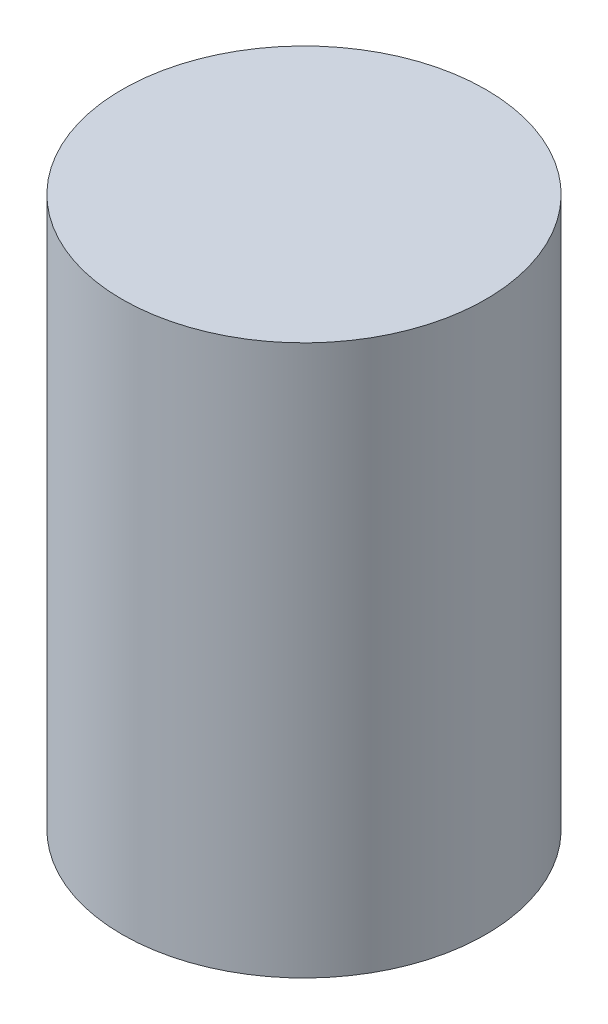
ISO-10303-21;
HEADER;
FILE_DESCRIPTION(('STEP AP214'),'2;1');
FILE_NAME('part.step','',(''),(''),'','','');
FILE_SCHEMA(('AUTOMOTIVE_DESIGN { 1 0 10303 214 1 1 1 1 }'));
ENDSEC;
DATA;
#1=APPLICATION_CONTEXT('core data for automotive mechanical design processes');
#2=APPLICATION_PROTOCOL_DEFINITION('international standard','automotive_design',2000,#1);
#3=PRODUCT_CONTEXT('',#1,'mechanical');
#4=PRODUCT('Part','Part','',(#3));
#5=PRODUCT_RELATED_PRODUCT_CATEGORY('part','',(#4));
#6=PRODUCT_DEFINITION_FORMATION('','',#4);
#7=PRODUCT_DEFINITION_CONTEXT('part definition',#1,'design');
#8=PRODUCT_DEFINITION('design','',#6,#7);
#9=PRODUCT_DEFINITION_SHAPE('','',#8);
#10=(LENGTH_UNIT() NAMED_UNIT(*) SI_UNIT(.MILLI.,.METRE.));
#11=(NAMED_UNIT(*) PLANE_ANGLE_UNIT() SI_UNIT($,.RADIAN.));
#12=(NAMED_UNIT(*) SI_UNIT($,.STERADIAN.) SOLID_ANGLE_UNIT());
#13=UNCERTAINTY_MEASURE_WITH_UNIT(LENGTH_MEASURE(1.E-05),#10,'distance_accuracy_value','');
#14=(GEOMETRIC_REPRESENTATION_CONTEXT(3) GLOBAL_UNCERTAINTY_ASSIGNED_CONTEXT((#13)) GLOBAL_UNIT_ASSIGNED_CONTEXT((#10,
#11,#12)) REPRESENTATION_CONTEXT('',''));
#15=CARTESIAN_POINT('',(0.,0.,0.));
#16=DIRECTION('',(0.,0.,1.));
#17=DIRECTION('',(1.,0.,0.));
#18=AXIS2_PLACEMENT_3D('',#15,#16,#17);
#19=CARTESIAN_POINT('',(0.,91.4399999999999,0.));
#20=DIRECTION('',(0.,-1.,0.));
#21=DIRECTION('',(0.,0.,-1.));
#22=AXIS2_PLACEMENT_3D('',#19,#20,#21);
#23=CYLINDRICAL_SURFACE('',#22,30.226);
#24=CARTESIAN_POINT('',(0.,91.4399999999999,0.));
#25=DIRECTION('',(0.,1.,0.));
#26=DIRECTION('',(0.,0.,1.));
#27=AXIS2_PLACEMENT_3D('',#24,#25,#26);
#28=CIRCLE('',#27,30.226);
#29=CARTESIAN_POINT('',(0.,91.4399999999999,30.226));
#30=VERTEX_POINT('',#29);
#31=EDGE_CURVE('E10',#30,#30,#28,.T.);
#32=ORIENTED_EDGE('',*,*,#31,.F.);
#33=EDGE_LOOP('',(#32));
#34=FACE_BOUND('',#33,.T.);
#35=CARTESIAN_POINT('',(0.,0.,0.));
#36=DIRECTION('',(0.,1.,0.));
#37=DIRECTION('',(0.,0.,1.));
#38=AXIS2_PLACEMENT_3D('',#35,#36,#37);
#39=CIRCLE('',#38,30.226);
#40=CARTESIAN_POINT('',(0.,0.,30.226));
#41=VERTEX_POINT('',#40);
#42=EDGE_CURVE('E38',#41,#41,#39,.T.);
#43=ORIENTED_EDGE('',*,*,#42,.T.);
#44=EDGE_LOOP('',(#43));
#45=FACE_BOUND('',#44,.T.);
#46=ADVANCED_FACE('F35',(#34,#45),#23,.T.);
#47=CARTESIAN_POINT('',(0.,91.4399999999999,0.));
#48=DIRECTION('',(0.,1.,0.));
#49=DIRECTION('',(0.,0.,1.));
#50=AXIS2_PLACEMENT_3D('',#47,#48,#49);
#51=PLANE('',#50);
#52=ORIENTED_EDGE('',*,*,#31,.T.);
#53=EDGE_LOOP('',(#52));
#54=FACE_BOUND('',#53,.T.);
#55=ADVANCED_FACE('F50',(#54),#51,.T.);
#56=CARTESIAN_POINT('',(0.,0.,0.));
#57=DIRECTION('',(0.,1.,0.));
#58=DIRECTION('',(0.,0.,1.));
#59=AXIS2_PLACEMENT_3D('',#56,#57,#58);
#60=PLANE('',#59);
#61=ORIENTED_EDGE('',*,*,#42,.F.);
#62=EDGE_LOOP('',(#61));
#63=FACE_BOUND('',#62,.T.);
#64=ADVANCED_FACE('F48',(#63),#60,.F.);
#65=CLOSED_SHELL('',(#46,#55,#64));
#66=MANIFOLD_SOLID_BREP('B2',#65);
#67=ADVANCED_BREP_SHAPE_REPRESENTATION('',(#18,#66),#14);
#68=SHAPE_DEFINITION_REPRESENTATION(#9,#67);
ENDSEC;
END-ISO-10303-21;
